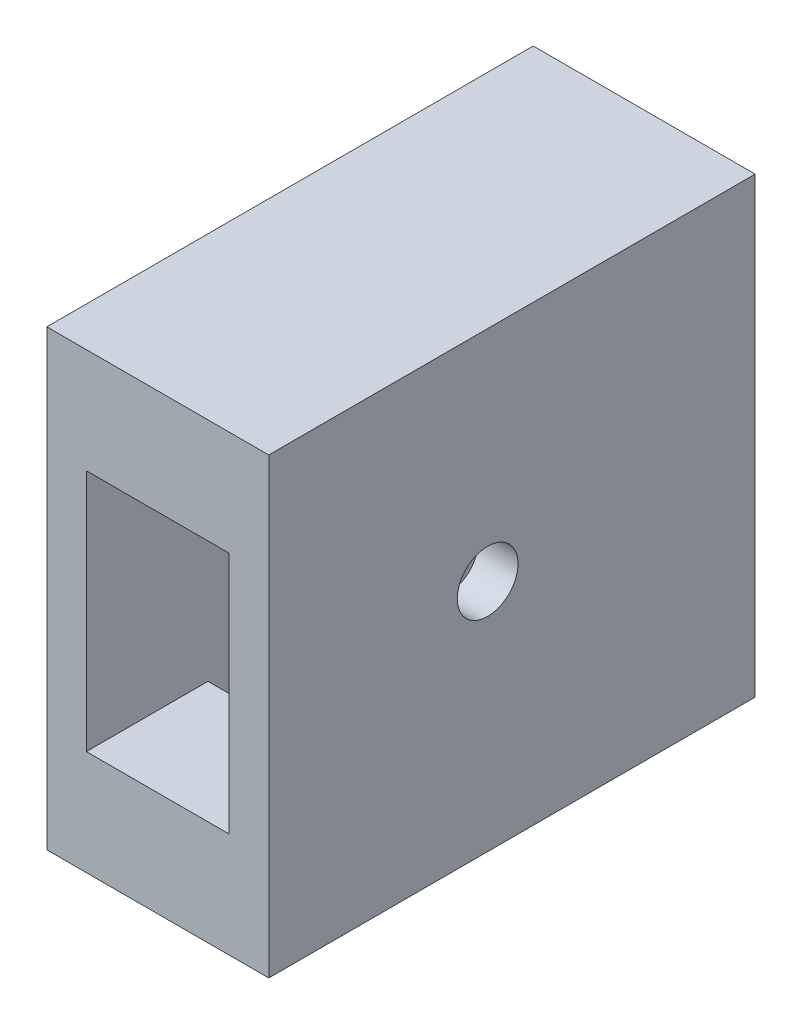
ISO-10303-21;
HEADER;
FILE_DESCRIPTION(('STEP AP214'),'2;1');
FILE_NAME('part.step','',(''),(''),'','','');
FILE_SCHEMA(('AUTOMOTIVE_DESIGN { 1 0 10303 214 1 1 1 1 }'));
ENDSEC;
DATA;
#1=APPLICATION_CONTEXT('core data for automotive mechanical design processes');
#2=APPLICATION_PROTOCOL_DEFINITION('international standard','automotive_design',2000,#1);
#3=PRODUCT_CONTEXT('',#1,'mechanical');
#4=PRODUCT('Part','Part','',(#3));
#5=PRODUCT_RELATED_PRODUCT_CATEGORY('part','',(#4));
#6=PRODUCT_DEFINITION_FORMATION('','',#4);
#7=PRODUCT_DEFINITION_CONTEXT('part definition',#1,'design');
#8=PRODUCT_DEFINITION('design','',#6,#7);
#9=PRODUCT_DEFINITION_SHAPE('','',#8);
#10=(LENGTH_UNIT() NAMED_UNIT(*) SI_UNIT(.MILLI.,.METRE.));
#11=(NAMED_UNIT(*) PLANE_ANGLE_UNIT() SI_UNIT($,.RADIAN.));
#12=(NAMED_UNIT(*) SI_UNIT($,.STERADIAN.) SOLID_ANGLE_UNIT());
#13=UNCERTAINTY_MEASURE_WITH_UNIT(LENGTH_MEASURE(1.E-05),#10,'distance_accuracy_value','');
#14=(GEOMETRIC_REPRESENTATION_CONTEXT(3) GLOBAL_UNCERTAINTY_ASSIGNED_CONTEXT((#13)) GLOBAL_UNIT_ASSIGNED_CONTEXT((#10,
#11,#12)) REPRESENTATION_CONTEXT('',''));
#15=CARTESIAN_POINT('',(0.,0.,0.));
#16=DIRECTION('',(0.,0.,1.));
#17=DIRECTION('',(1.,0.,0.));
#18=AXIS2_PLACEMENT_3D('',#15,#16,#17);
#19=CARTESIAN_POINT('',(0.,0.,16.));
#20=DIRECTION('',(1.,0.,0.));
#21=DIRECTION('',(0.,0.,-1.));
#22=AXIS2_PLACEMENT_3D('',#19,#20,#21);
#23=PLANE('',#22);
#24=CARTESIAN_POINT('',(0.,6.4,8.8));
#25=DIRECTION('',(1.,0.,0.));
#26=DIRECTION('',(0.,0.,-1.));
#27=AXIS2_PLACEMENT_3D('',#24,#25,#26);
#28=CIRCLE('',#27,1.);
#29=CARTESIAN_POINT('',(0.,6.4,7.8));
#30=VERTEX_POINT('',#29);
#31=EDGE_CURVE('E342',#30,#30,#28,.T.);
#32=ORIENTED_EDGE('',*,*,#31,.F.);
#33=EDGE_LOOP('',(#32));
#34=FACE_BOUND('',#33,.T.);
#35=DIRECTION('',(0.,-1.,0.));
#36=VECTOR('',#35,1.);
#37=CARTESIAN_POINT('',(0.,0.,12.));
#38=LINE('',#37,#36);
#39=CARTESIAN_POINT('',(0.,2.15,12.));
#40=VERTEX_POINT('',#39);
#41=CARTESIAN_POINT('',(0.,0.,12.));
#42=VERTEX_POINT('',#41);
#43=EDGE_CURVE('E143',#40,#42,#38,.T.);
#44=ORIENTED_EDGE('',*,*,#43,.T.);
#45=DIRECTION('',(0.,0.,-1.));
#46=VECTOR('',#45,1.);
#47=CARTESIAN_POINT('',(0.,0.,16.));
#48=LINE('',#47,#46);
#49=CARTESIAN_POINT('',(0.,0.,0.));
#50=VERTEX_POINT('',#49);
#51=EDGE_CURVE('E136',#42,#50,#48,.T.);
#52=ORIENTED_EDGE('',*,*,#51,.T.);
#53=DIRECTION('',(0.,-1.,0.));
#54=VECTOR('',#53,1.);
#55=CARTESIAN_POINT('',(0.,0.,0.));
#56=LINE('',#55,#54);
#57=CARTESIAN_POINT('',(0.,12.3,0.));
#58=VERTEX_POINT('',#57);
#59=EDGE_CURVE('E140',#58,#50,#56,.T.);
#60=ORIENTED_EDGE('',*,*,#59,.F.);
#61=DIRECTION('',(0.,0.,-1.));
#62=VECTOR('',#61,1.);
#63=CARTESIAN_POINT('',(0.,12.3,16.));
#64=LINE('',#63,#62);
#65=CARTESIAN_POINT('',(0.,12.3,12.));
#66=VERTEX_POINT('',#65);
#67=EDGE_CURVE('E178',#66,#58,#64,.T.);
#68=ORIENTED_EDGE('',*,*,#67,.F.);
#69=DIRECTION('',(0.,-1.,0.));
#70=VECTOR('',#69,1.);
#71=CARTESIAN_POINT('',(0.,12.3,12.));
#72=LINE('',#71,#70);
#73=CARTESIAN_POINT('',(0.,10.15,12.));
#74=VERTEX_POINT('',#73);
#75=EDGE_CURVE('E298',#66,#74,#72,.T.);
#76=ORIENTED_EDGE('',*,*,#75,.T.);
#77=DIRECTION('',(0.,0.,-1.));
#78=VECTOR('',#77,1.);
#79=CARTESIAN_POINT('',(0.,10.15,21.1684136831333));
#80=LINE('',#79,#78);
#81=CARTESIAN_POINT('',(0.,10.15,16.));
#82=VERTEX_POINT('',#81);
#83=EDGE_CURVE('E167',#82,#74,#80,.T.);
#84=ORIENTED_EDGE('',*,*,#83,.F.);
#85=DIRECTION('',(0.,-1.,0.));
#86=VECTOR('',#85,1.);
#87=CARTESIAN_POINT('',(0.,0.,16.));
#88=LINE('',#87,#86);
#89=CARTESIAN_POINT('',(0.,2.15,16.));
#90=VERTEX_POINT('',#89);
#91=EDGE_CURVE('E177',#82,#90,#88,.T.);
#92=ORIENTED_EDGE('',*,*,#91,.T.);
#93=DIRECTION('',(0.,0.,-1.));
#94=VECTOR('',#93,1.);
#95=CARTESIAN_POINT('',(0.,2.15,21.1684136831333));
#96=LINE('',#95,#94);
#97=EDGE_CURVE('E62',#90,#40,#96,.T.);
#98=ORIENTED_EDGE('',*,*,#97,.T.);
#99=EDGE_LOOP('',(#44,#52,#60,#68,#76,#84,#92,#98));
#100=FACE_BOUND('',#99,.T.);
#101=ADVANCED_FACE('F45',(#34,#100),#23,.T.);
#102=CARTESIAN_POINT('',(4.7,0.,16.));
#103=DIRECTION('',(-1.,0.,0.));
#104=DIRECTION('',(0.,0.,1.));
#105=AXIS2_PLACEMENT_3D('',#102,#103,#104);
#106=PLANE('',#105);
#107=CARTESIAN_POINT('',(4.7,6.4,8.8));
#108=DIRECTION('',(-1.,0.,0.));
#109=DIRECTION('',(0.,0.,1.));
#110=AXIS2_PLACEMENT_3D('',#107,#108,#109);
#111=CIRCLE('',#110,1.);
#112=CARTESIAN_POINT('',(4.7,6.4,9.8));
#113=VERTEX_POINT('',#112);
#114=EDGE_CURVE('E346',#113,#113,#111,.T.);
#115=ORIENTED_EDGE('',*,*,#114,.F.);
#116=EDGE_LOOP('',(#115));
#117=FACE_BOUND('',#116,.T.);
#118=DIRECTION('',(0.,1.,0.));
#119=VECTOR('',#118,1.);
#120=CARTESIAN_POINT('',(4.7,0.,12.));
#121=LINE('',#120,#119);
#122=CARTESIAN_POINT('',(4.7,0.,12.));
#123=VERTEX_POINT('',#122);
#124=CARTESIAN_POINT('',(4.7,2.15,12.));
#125=VERTEX_POINT('',#124);
#126=EDGE_CURVE('E70',#123,#125,#121,.T.);
#127=ORIENTED_EDGE('',*,*,#126,.T.);
#128=DIRECTION('',(0.,0.,-1.));
#129=VECTOR('',#128,1.);
#130=CARTESIAN_POINT('',(4.7,2.15,21.1684136831333));
#131=LINE('',#130,#129);
#132=CARTESIAN_POINT('',(4.7,2.15,16.));
#133=VERTEX_POINT('',#132);
#134=EDGE_CURVE('E319',#133,#125,#131,.T.);
#135=ORIENTED_EDGE('',*,*,#134,.F.);
#136=DIRECTION('',(0.,1.,0.));
#137=VECTOR('',#136,1.);
#138=CARTESIAN_POINT('',(4.7,0.,16.));
#139=LINE('',#138,#137);
#140=CARTESIAN_POINT('',(4.7,10.15,16.));
#141=VERTEX_POINT('',#140);
#142=EDGE_CURVE('E170',#133,#141,#139,.T.);
#143=ORIENTED_EDGE('',*,*,#142,.T.);
#144=DIRECTION('',(0.,0.,-1.));
#145=VECTOR('',#144,1.);
#146=CARTESIAN_POINT('',(4.7,10.15,21.1684136831333));
#147=LINE('',#146,#145);
#148=CARTESIAN_POINT('',(4.7,10.15,12.));
#149=VERTEX_POINT('',#148);
#150=EDGE_CURVE('E300',#141,#149,#147,.T.);
#151=ORIENTED_EDGE('',*,*,#150,.T.);
#152=DIRECTION('',(0.,1.,0.));
#153=VECTOR('',#152,1.);
#154=CARTESIAN_POINT('',(4.7,12.3,12.));
#155=LINE('',#154,#153);
#156=CARTESIAN_POINT('',(4.7,12.3,12.));
#157=VERTEX_POINT('',#156);
#158=EDGE_CURVE('E297',#149,#157,#155,.T.);
#159=ORIENTED_EDGE('',*,*,#158,.T.);
#160=DIRECTION('',(0.,0.,-1.));
#161=VECTOR('',#160,1.);
#162=CARTESIAN_POINT('',(4.7,12.3,16.));
#163=LINE('',#162,#161);
#164=CARTESIAN_POINT('',(4.7,12.3,0.));
#165=VERTEX_POINT('',#164);
#166=EDGE_CURVE('E181',#157,#165,#163,.T.);
#167=ORIENTED_EDGE('',*,*,#166,.T.);
#168=DIRECTION('',(0.,1.,0.));
#169=VECTOR('',#168,1.);
#170=CARTESIAN_POINT('',(4.7,0.,0.));
#171=LINE('',#170,#169);
#172=CARTESIAN_POINT('',(4.7,0.,0.));
#173=VERTEX_POINT('',#172);
#174=EDGE_CURVE('E157',#173,#165,#171,.T.);
#175=ORIENTED_EDGE('',*,*,#174,.F.);
#176=DIRECTION('',(0.,0.,-1.));
#177=VECTOR('',#176,1.);
#178=CARTESIAN_POINT('',(4.7,0.,16.));
#179=LINE('',#178,#177);
#180=EDGE_CURVE('E148',#123,#173,#179,.T.);
#181=ORIENTED_EDGE('',*,*,#180,.F.);
#182=EDGE_LOOP('',(#127,#135,#143,#151,#159,#167,#175,#181));
#183=FACE_BOUND('',#182,.T.);
#184=ADVANCED_FACE('F250',(#117,#183),#106,.T.);
#185=CARTESIAN_POINT('',(0.,12.3,16.));
#186=DIRECTION('',(0.,-1.,0.));
#187=DIRECTION('',(0.,0.,-1.));
#188=AXIS2_PLACEMENT_3D('',#185,#186,#187);
#189=PLANE('',#188);
#190=ORIENTED_EDGE('',*,*,#166,.F.);
#191=DIRECTION('',(-1.,0.,0.));
#192=VECTOR('',#191,1.);
#193=CARTESIAN_POINT('',(0.,12.3,12.));
#194=LINE('',#193,#192);
#195=EDGE_CURVE('E294',#157,#66,#194,.T.);
#196=ORIENTED_EDGE('',*,*,#195,.T.);
#197=ORIENTED_EDGE('',*,*,#67,.T.);
#198=DIRECTION('',(-1.,0.,0.));
#199=VECTOR('',#198,1.);
#200=CARTESIAN_POINT('',(0.,12.3,0.));
#201=LINE('',#200,#199);
#202=EDGE_CURVE('E161',#165,#58,#201,.T.);
#203=ORIENTED_EDGE('',*,*,#202,.F.);
#204=EDGE_LOOP('',(#190,#196,#197,#203));
#205=FACE_BOUND('',#204,.T.);
#206=ADVANCED_FACE('F256',(#205),#189,.T.);
#207=CARTESIAN_POINT('',(0.,0.,16.));
#208=DIRECTION('',(0.,0.,-1.));
#209=DIRECTION('',(-1.,0.,0.));
#210=AXIS2_PLACEMENT_3D('',#207,#208,#209);
#211=PLANE('',#210);
#212=ORIENTED_EDGE('',*,*,#142,.F.);
#213=DIRECTION('',(1.,0.,0.));
#214=VECTOR('',#213,1.);
#215=CARTESIAN_POINT('',(0.,2.15,16.));
#216=LINE('',#215,#214);
#217=EDGE_CURVE('E339',#90,#133,#216,.T.);
#218=ORIENTED_EDGE('',*,*,#217,.F.);
#219=ORIENTED_EDGE('',*,*,#91,.F.);
#220=DIRECTION('',(-1.,0.,0.));
#221=VECTOR('',#220,1.);
#222=CARTESIAN_POINT('',(0.,10.15,16.));
#223=LINE('',#222,#221);
#224=EDGE_CURVE('E163',#141,#82,#223,.T.);
#225=ORIENTED_EDGE('',*,*,#224,.F.);
#226=EDGE_LOOP('',(#212,#218,#219,#225));
#227=FACE_BOUND('',#226,.T.);
#228=DIRECTION('',(0.,-1.,0.));
#229=VECTOR('',#228,1.);
#230=CARTESIAN_POINT('',(-1.3,-1.3,16.));
#231=LINE('',#230,#229);
#232=CARTESIAN_POINT('',(-1.3,13.6,16.));
#233=VERTEX_POINT('',#232);
#234=CARTESIAN_POINT('',(-1.3,-1.3,16.));
#235=VERTEX_POINT('',#234);
#236=EDGE_CURVE('E186',#233,#235,#231,.T.);
#237=ORIENTED_EDGE('',*,*,#236,.T.);
#238=DIRECTION('',(1.,0.,0.));
#239=VECTOR('',#238,1.);
#240=CARTESIAN_POINT('',(-1.3,-1.3,16.));
#241=LINE('',#240,#239);
#242=CARTESIAN_POINT('',(6.,-1.3,16.));
#243=VERTEX_POINT('',#242);
#244=EDGE_CURVE('E190',#235,#243,#241,.T.);
#245=ORIENTED_EDGE('',*,*,#244,.T.);
#246=DIRECTION('',(0.,1.,0.));
#247=VECTOR('',#246,1.);
#248=CARTESIAN_POINT('',(6.,-1.3,16.));
#249=LINE('',#248,#247);
#250=CARTESIAN_POINT('',(6.,13.6,16.));
#251=VERTEX_POINT('',#250);
#252=EDGE_CURVE('E194',#243,#251,#249,.T.);
#253=ORIENTED_EDGE('',*,*,#252,.T.);
#254=DIRECTION('',(-1.,0.,0.));
#255=VECTOR('',#254,1.);
#256=CARTESIAN_POINT('',(-1.3,13.6,16.));
#257=LINE('',#256,#255);
#258=EDGE_CURVE('E197',#251,#233,#257,.T.);
#259=ORIENTED_EDGE('',*,*,#258,.T.);
#260=EDGE_LOOP('',(#237,#245,#253,#259));
#261=FACE_BOUND('',#260,.T.);
#262=ADVANCED_FACE('F239',(#227,#261),#211,.F.);
#263=CARTESIAN_POINT('',(0.,0.,0.));
#264=DIRECTION('',(0.,0.,-1.));
#265=DIRECTION('',(-1.,0.,0.));
#266=AXIS2_PLACEMENT_3D('',#263,#264,#265);
#267=PLANE('',#266);
#268=DIRECTION('',(0.,-1.,0.));
#269=VECTOR('',#268,1.);
#270=CARTESIAN_POINT('',(-1.3,-1.3,0.));
#271=LINE('',#270,#269);
#272=CARTESIAN_POINT('',(-1.3,13.6,0.));
#273=VERTEX_POINT('',#272);
#274=CARTESIAN_POINT('',(-1.3,-1.3,0.));
#275=VERTEX_POINT('',#274);
#276=EDGE_CURVE('E147',#273,#275,#271,.T.);
#277=ORIENTED_EDGE('',*,*,#276,.F.);
#278=DIRECTION('',(-1.,0.,0.));
#279=VECTOR('',#278,1.);
#280=CARTESIAN_POINT('',(-1.3,13.6,0.));
#281=LINE('',#280,#279);
#282=CARTESIAN_POINT('',(6.,13.6,0.));
#283=VERTEX_POINT('',#282);
#284=EDGE_CURVE('E191',#283,#273,#281,.T.);
#285=ORIENTED_EDGE('',*,*,#284,.F.);
#286=DIRECTION('',(0.,1.,0.));
#287=VECTOR('',#286,1.);
#288=CARTESIAN_POINT('',(6.,-1.3,0.));
#289=LINE('',#288,#287);
#290=CARTESIAN_POINT('',(6.,-1.3,0.));
#291=VERTEX_POINT('',#290);
#292=EDGE_CURVE('E207',#291,#283,#289,.T.);
#293=ORIENTED_EDGE('',*,*,#292,.F.);
#294=DIRECTION('',(1.,0.,0.));
#295=VECTOR('',#294,1.);
#296=CARTESIAN_POINT('',(-1.3,-1.3,0.));
#297=LINE('',#296,#295);
#298=EDGE_CURVE('E204',#275,#291,#297,.T.);
#299=ORIENTED_EDGE('',*,*,#298,.F.);
#300=EDGE_LOOP('',(#277,#285,#293,#299));
#301=FACE_BOUND('',#300,.T.);
#302=ORIENTED_EDGE('',*,*,#202,.T.);
#303=ORIENTED_EDGE('',*,*,#59,.T.);
#304=DIRECTION('',(1.,0.,0.));
#305=VECTOR('',#304,1.);
#306=CARTESIAN_POINT('',(0.,0.,0.));
#307=LINE('',#306,#305);
#308=EDGE_CURVE('E151',#50,#173,#307,.T.);
#309=ORIENTED_EDGE('',*,*,#308,.T.);
#310=ORIENTED_EDGE('',*,*,#174,.T.);
#311=EDGE_LOOP('',(#302,#303,#309,#310));
#312=FACE_BOUND('',#311,.T.);
#313=ADVANCED_FACE('F159',(#301,#312),#267,.T.);
#314=CARTESIAN_POINT('',(-1.3,-1.3,16.));
#315=DIRECTION('',(1.,0.,0.));
#316=DIRECTION('',(0.,0.,-1.));
#317=AXIS2_PLACEMENT_3D('',#314,#315,#316);
#318=PLANE('',#317);
#319=CARTESIAN_POINT('',(-1.3,6.4,8.8));
#320=DIRECTION('',(-1.,0.,0.));
#321=DIRECTION('',(0.,0.,1.));
#322=AXIS2_PLACEMENT_3D('',#319,#320,#321);
#323=CIRCLE('',#322,1.);
#324=CARTESIAN_POINT('',(-1.3,6.4,9.8));
#325=VERTEX_POINT('',#324);
#326=EDGE_CURVE('E350',#325,#325,#323,.T.);
#327=ORIENTED_EDGE('',*,*,#326,.F.);
#328=EDGE_LOOP('',(#327));
#329=FACE_BOUND('',#328,.T.);
#330=ORIENTED_EDGE('',*,*,#276,.T.);
#331=DIRECTION('',(0.,0.,-1.));
#332=VECTOR('',#331,1.);
#333=CARTESIAN_POINT('',(-1.3,-1.3,16.));
#334=LINE('',#333,#332);
#335=EDGE_CURVE('E11',#235,#275,#334,.T.);
#336=ORIENTED_EDGE('',*,*,#335,.F.);
#337=ORIENTED_EDGE('',*,*,#236,.F.);
#338=DIRECTION('',(0.,0.,-1.));
#339=VECTOR('',#338,1.);
#340=CARTESIAN_POINT('',(-1.3,13.6,16.));
#341=LINE('',#340,#339);
#342=EDGE_CURVE('E200',#233,#273,#341,.T.);
#343=ORIENTED_EDGE('',*,*,#342,.T.);
#344=EDGE_LOOP('',(#330,#336,#337,#343));
#345=FACE_BOUND('',#344,.T.);
#346=ADVANCED_FACE('F47',(#329,#345),#318,.F.);
#347=CARTESIAN_POINT('',(-1.3,-1.3,16.));
#348=DIRECTION('',(0.,1.,0.));
#349=DIRECTION('',(0.,0.,1.));
#350=AXIS2_PLACEMENT_3D('',#347,#348,#349);
#351=PLANE('',#350);
#352=ORIENTED_EDGE('',*,*,#298,.T.);
#353=DIRECTION('',(0.,0.,-1.));
#354=VECTOR('',#353,1.);
#355=CARTESIAN_POINT('',(6.,-1.3,16.));
#356=LINE('',#355,#354);
#357=EDGE_CURVE('E55',#243,#291,#356,.T.);
#358=ORIENTED_EDGE('',*,*,#357,.F.);
#359=ORIENTED_EDGE('',*,*,#244,.F.);
#360=ORIENTED_EDGE('',*,*,#335,.T.);
#361=EDGE_LOOP('',(#352,#358,#359,#360));
#362=FACE_BOUND('',#361,.T.);
#363=ADVANCED_FACE('F240',(#362),#351,.F.);
#364=CARTESIAN_POINT('',(6.,-1.3,16.));
#365=DIRECTION('',(-1.,0.,0.));
#366=DIRECTION('',(0.,0.,1.));
#367=AXIS2_PLACEMENT_3D('',#364,#365,#366);
#368=PLANE('',#367);
#369=CARTESIAN_POINT('',(6.,6.4,8.8));
#370=DIRECTION('',(-1.,0.,0.));
#371=DIRECTION('',(0.,0.,1.));
#372=AXIS2_PLACEMENT_3D('',#369,#370,#371);
#373=CIRCLE('',#372,1.);
#374=CARTESIAN_POINT('',(6.,6.4,9.8));
#375=VERTEX_POINT('',#374);
#376=EDGE_CURVE('E49',#375,#375,#373,.T.);
#377=ORIENTED_EDGE('',*,*,#376,.T.);
#378=EDGE_LOOP('',(#377));
#379=FACE_BOUND('',#378,.T.);
#380=ORIENTED_EDGE('',*,*,#292,.T.);
#381=DIRECTION('',(0.,0.,-1.));
#382=VECTOR('',#381,1.);
#383=CARTESIAN_POINT('',(6.,13.6,16.));
#384=LINE('',#383,#382);
#385=EDGE_CURVE('E215',#251,#283,#384,.T.);
#386=ORIENTED_EDGE('',*,*,#385,.F.);
#387=ORIENTED_EDGE('',*,*,#252,.F.);
#388=ORIENTED_EDGE('',*,*,#357,.T.);
#389=EDGE_LOOP('',(#380,#386,#387,#388));
#390=FACE_BOUND('',#389,.T.);
#391=ADVANCED_FACE('F225',(#379,#390),#368,.F.);
#392=CARTESIAN_POINT('',(-1.3,13.6,16.));
#393=DIRECTION('',(0.,-1.,0.));
#394=DIRECTION('',(0.,0.,-1.));
#395=AXIS2_PLACEMENT_3D('',#392,#393,#394);
#396=PLANE('',#395);
#397=ORIENTED_EDGE('',*,*,#284,.T.);
#398=ORIENTED_EDGE('',*,*,#342,.F.);
#399=ORIENTED_EDGE('',*,*,#258,.F.);
#400=ORIENTED_EDGE('',*,*,#385,.T.);
#401=EDGE_LOOP('',(#397,#398,#399,#400));
#402=FACE_BOUND('',#401,.T.);
#403=ADVANCED_FACE('F233',(#402),#396,.F.);
#404=CARTESIAN_POINT('',(0.,0.,16.));
#405=DIRECTION('',(0.,1.,0.));
#406=DIRECTION('',(0.,0.,1.));
#407=AXIS2_PLACEMENT_3D('',#404,#405,#406);
#408=PLANE('',#407);
#409=DIRECTION('',(1.,0.,0.));
#410=VECTOR('',#409,1.);
#411=CARTESIAN_POINT('',(0.,0.,12.));
#412=LINE('',#411,#410);
#413=EDGE_CURVE('E327',#42,#123,#412,.T.);
#414=ORIENTED_EDGE('',*,*,#413,.T.);
#415=ORIENTED_EDGE('',*,*,#180,.T.);
#416=ORIENTED_EDGE('',*,*,#308,.F.);
#417=ORIENTED_EDGE('',*,*,#51,.F.);
#418=EDGE_LOOP('',(#414,#415,#416,#417));
#419=FACE_BOUND('',#418,.T.);
#420=ADVANCED_FACE('F152',(#419),#408,.T.);
#421=CARTESIAN_POINT('',(0.,0.,12.));
#422=DIRECTION('',(0.,0.,1.));
#423=DIRECTION('',(1.,0.,0.));
#424=AXIS2_PLACEMENT_3D('',#421,#422,#423);
#425=PLANE('',#424);
#426=ORIENTED_EDGE('',*,*,#75,.F.);
#427=ORIENTED_EDGE('',*,*,#195,.F.);
#428=ORIENTED_EDGE('',*,*,#158,.F.);
#429=DIRECTION('',(1.,0.,0.));
#430=VECTOR('',#429,1.);
#431=CARTESIAN_POINT('',(0.,10.15,12.));
#432=LINE('',#431,#430);
#433=EDGE_CURVE('E305',#74,#149,#432,.T.);
#434=ORIENTED_EDGE('',*,*,#433,.F.);
#435=EDGE_LOOP('',(#426,#427,#428,#434));
#436=FACE_BOUND('',#435,.T.);
#437=ADVANCED_FACE('F271',(#436),#425,.F.);
#438=CARTESIAN_POINT('',(0.,10.15,21.1684136831333));
#439=DIRECTION('',(0.,1.,0.));
#440=DIRECTION('',(0.,0.,1.));
#441=AXIS2_PLACEMENT_3D('',#438,#439,#440);
#442=PLANE('',#441);
#443=ORIENTED_EDGE('',*,*,#150,.F.);
#444=ORIENTED_EDGE('',*,*,#224,.T.);
#445=ORIENTED_EDGE('',*,*,#83,.T.);
#446=ORIENTED_EDGE('',*,*,#433,.T.);
#447=EDGE_LOOP('',(#443,#444,#445,#446));
#448=FACE_BOUND('',#447,.T.);
#449=ADVANCED_FACE('F275',(#448),#442,.F.);
#450=CARTESIAN_POINT('',(0.,0.,12.));
#451=DIRECTION('',(0.,0.,-1.));
#452=DIRECTION('',(-1.,0.,0.));
#453=AXIS2_PLACEMENT_3D('',#450,#451,#452);
#454=PLANE('',#453);
#455=ORIENTED_EDGE('',*,*,#43,.F.);
#456=DIRECTION('',(-1.,0.,0.));
#457=VECTOR('',#456,1.);
#458=CARTESIAN_POINT('',(0.,2.15,12.));
#459=LINE('',#458,#457);
#460=EDGE_CURVE('E332',#125,#40,#459,.T.);
#461=ORIENTED_EDGE('',*,*,#460,.F.);
#462=ORIENTED_EDGE('',*,*,#126,.F.);
#463=ORIENTED_EDGE('',*,*,#413,.F.);
#464=EDGE_LOOP('',(#455,#461,#462,#463));
#465=FACE_BOUND('',#464,.T.);
#466=ADVANCED_FACE('F281',(#465),#454,.T.);
#467=CARTESIAN_POINT('',(0.,2.15,21.1684136831333));
#468=DIRECTION('',(0.,-1.,0.));
#469=DIRECTION('',(0.,0.,-1.));
#470=AXIS2_PLACEMENT_3D('',#467,#468,#469);
#471=PLANE('',#470);
#472=ORIENTED_EDGE('',*,*,#97,.F.);
#473=ORIENTED_EDGE('',*,*,#217,.T.);
#474=ORIENTED_EDGE('',*,*,#134,.T.);
#475=ORIENTED_EDGE('',*,*,#460,.T.);
#476=EDGE_LOOP('',(#472,#473,#474,#475));
#477=FACE_BOUND('',#476,.T.);
#478=ADVANCED_FACE('F362',(#477),#471,.F.);
#479=CARTESIAN_POINT('',(13.7,6.4,8.8));
#480=DIRECTION('',(-1.,0.,0.));
#481=DIRECTION('',(0.,0.,1.));
#482=AXIS2_PLACEMENT_3D('',#479,#480,#481);
#483=CYLINDRICAL_SURFACE('',#482,1.);
#484=ORIENTED_EDGE('',*,*,#114,.T.);
#485=EDGE_LOOP('',(#484));
#486=FACE_BOUND('',#485,.T.);
#487=ORIENTED_EDGE('',*,*,#376,.F.);
#488=EDGE_LOOP('',(#487));
#489=FACE_BOUND('',#488,.T.);
#490=ADVANCED_FACE('F359',(#486,#489),#483,.F.);
#491=ORIENTED_EDGE('',*,*,#31,.T.);
#492=EDGE_LOOP('',(#491));
#493=FACE_BOUND('',#492,.T.);
#494=ORIENTED_EDGE('',*,*,#326,.T.);
#495=EDGE_LOOP('',(#494));
#496=FACE_BOUND('',#495,.T.);
#497=ADVANCED_FACE('F361',(#493,#496),#483,.F.);
#498=CLOSED_SHELL('',(#101,#184,#206,#262,#313,#346,#363,#391,#403,#420,#437,#449,#466,#478,
#490,#497));
#499=MANIFOLD_SOLID_BREP('B2',#498);
#500=ADVANCED_BREP_SHAPE_REPRESENTATION('',(#18,#499),#14);
#501=SHAPE_DEFINITION_REPRESENTATION(#9,#500);
ENDSEC;
END-ISO-10303-21;
